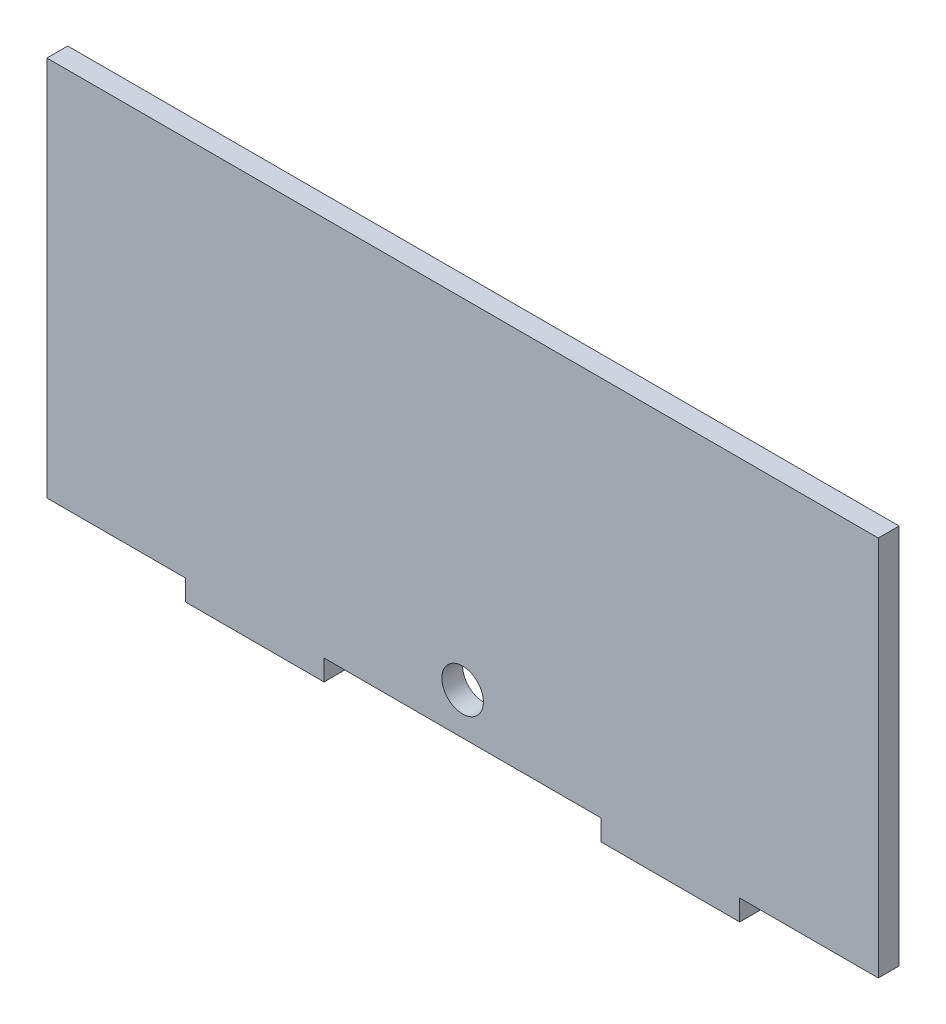
ISO-10303-21;
HEADER;
FILE_DESCRIPTION(('STEP AP214'),'2;1');
FILE_NAME('part.step','',(''),(''),'','','');
FILE_SCHEMA(('AUTOMOTIVE_DESIGN { 1 0 10303 214 1 1 1 1 }'));
ENDSEC;
DATA;
#1=APPLICATION_CONTEXT('core data for automotive mechanical design processes');
#2=APPLICATION_PROTOCOL_DEFINITION('international standard','automotive_design',2000,#1);
#3=PRODUCT_CONTEXT('',#1,'mechanical');
#4=PRODUCT('Part','Part','',(#3));
#5=PRODUCT_RELATED_PRODUCT_CATEGORY('part','',(#4));
#6=PRODUCT_DEFINITION_FORMATION('','',#4);
#7=PRODUCT_DEFINITION_CONTEXT('part definition',#1,'design');
#8=PRODUCT_DEFINITION('design','',#6,#7);
#9=PRODUCT_DEFINITION_SHAPE('','',#8);
#10=(LENGTH_UNIT() NAMED_UNIT(*) SI_UNIT(.MILLI.,.METRE.));
#11=(NAMED_UNIT(*) PLANE_ANGLE_UNIT() SI_UNIT($,.RADIAN.));
#12=(NAMED_UNIT(*) SI_UNIT($,.STERADIAN.) SOLID_ANGLE_UNIT());
#13=UNCERTAINTY_MEASURE_WITH_UNIT(LENGTH_MEASURE(1.E-05),#10,'distance_accuracy_value','');
#14=(GEOMETRIC_REPRESENTATION_CONTEXT(3) GLOBAL_UNCERTAINTY_ASSIGNED_CONTEXT((#13)) GLOBAL_UNIT_ASSIGNED_CONTEXT((#10,
#11,#12)) REPRESENTATION_CONTEXT('',''));
#15=CARTESIAN_POINT('',(0.,0.,0.));
#16=DIRECTION('',(0.,0.,1.));
#17=DIRECTION('',(1.,0.,0.));
#18=AXIS2_PLACEMENT_3D('',#15,#16,#17);
#19=CARTESIAN_POINT('',(0.,0.,-3.));
#20=DIRECTION('',(0.,-1.,0.));
#21=DIRECTION('',(0.,0.,-1.));
#22=AXIS2_PLACEMENT_3D('',#19,#20,#21);
#23=PLANE('',#22);
#24=DIRECTION('',(0.,0.,1.));
#25=VECTOR('',#24,1.);
#26=CARTESIAN_POINT('',(80.,0.,-3.));
#27=LINE('',#26,#25);
#28=CARTESIAN_POINT('',(80.,0.,-3.));
#29=VERTEX_POINT('',#28);
#30=CARTESIAN_POINT('',(80.,0.,0.));
#31=VERTEX_POINT('',#30);
#32=EDGE_CURVE('E147',#29,#31,#27,.T.);
#33=ORIENTED_EDGE('',*,*,#32,.T.);
#34=DIRECTION('',(1.,0.,0.));
#35=VECTOR('',#34,1.);
#36=CARTESIAN_POINT('',(0.,0.,0.));
#37=LINE('',#36,#35);
#38=CARTESIAN_POINT('',(40.,0.,0.));
#39=VERTEX_POINT('',#38);
#40=EDGE_CURVE('E211',#39,#31,#37,.T.);
#41=ORIENTED_EDGE('',*,*,#40,.F.);
#42=DIRECTION('',(0.,0.,1.));
#43=VECTOR('',#42,1.);
#44=CARTESIAN_POINT('',(40.,0.,-3.));
#45=LINE('',#44,#43);
#46=CARTESIAN_POINT('',(40.,0.,-3.));
#47=VERTEX_POINT('',#46);
#48=EDGE_CURVE('E178',#47,#39,#45,.T.);
#49=ORIENTED_EDGE('',*,*,#48,.F.);
#50=DIRECTION('',(1.,0.,0.));
#51=VECTOR('',#50,1.);
#52=CARTESIAN_POINT('',(0.,0.,-3.));
#53=LINE('',#52,#51);
#54=EDGE_CURVE('E198',#47,#29,#53,.T.);
#55=ORIENTED_EDGE('',*,*,#54,.T.);
#56=EDGE_LOOP('',(#33,#41,#49,#55));
#57=FACE_BOUND('',#56,.T.);
#58=ADVANCED_FACE('F33',(#57),#23,.T.);
#59=CARTESIAN_POINT('',(0.,0.,-3.));
#60=VERTEX_POINT('',#59);
#61=CARTESIAN_POINT('',(20.,0.,-3.));
#62=VERTEX_POINT('',#61);
#63=EDGE_CURVE('E194',#60,#62,#53,.T.);
#64=ORIENTED_EDGE('',*,*,#63,.T.);
#65=DIRECTION('',(0.,0.,1.));
#66=VECTOR('',#65,1.);
#67=CARTESIAN_POINT('',(20.,0.,-3.));
#68=LINE('',#67,#66);
#69=CARTESIAN_POINT('',(20.,0.,0.));
#70=VERTEX_POINT('',#69);
#71=EDGE_CURVE('E175',#62,#70,#68,.T.);
#72=ORIENTED_EDGE('',*,*,#71,.T.);
#73=CARTESIAN_POINT('',(0.,0.,0.));
#74=VERTEX_POINT('',#73);
#75=EDGE_CURVE('E207',#74,#70,#37,.T.);
#76=ORIENTED_EDGE('',*,*,#75,.F.);
#77=DIRECTION('',(0.,0.,1.));
#78=VECTOR('',#77,1.);
#79=CARTESIAN_POINT('',(0.,0.,-3.));
#80=LINE('',#79,#78);
#81=EDGE_CURVE('E37',#60,#74,#80,.T.);
#82=ORIENTED_EDGE('',*,*,#81,.F.);
#83=EDGE_LOOP('',(#64,#72,#76,#82));
#84=FACE_BOUND('',#83,.T.);
#85=ADVANCED_FACE('F227',(#84),#23,.T.);
#86=CARTESIAN_POINT('',(0.,0.,-3.));
#87=DIRECTION('',(-1.,0.,0.));
#88=DIRECTION('',(0.,0.,1.));
#89=AXIS2_PLACEMENT_3D('',#86,#87,#88);
#90=PLANE('',#89);
#91=DIRECTION('',(0.,-1.,0.));
#92=VECTOR('',#91,1.);
#93=CARTESIAN_POINT('',(0.,0.,0.));
#94=LINE('',#93,#92);
#95=CARTESIAN_POINT('',(0.,55.,0.));
#96=VERTEX_POINT('',#95);
#97=EDGE_CURVE('E186',#96,#74,#94,.T.);
#98=ORIENTED_EDGE('',*,*,#97,.F.);
#99=DIRECTION('',(0.,0.,1.));
#100=VECTOR('',#99,1.);
#101=CARTESIAN_POINT('',(0.,55.,-3.));
#102=LINE('',#101,#100);
#103=CARTESIAN_POINT('',(0.,55.,-3.));
#104=VERTEX_POINT('',#103);
#105=EDGE_CURVE('E11',#104,#96,#102,.T.);
#106=ORIENTED_EDGE('',*,*,#105,.F.);
#107=DIRECTION('',(0.,-1.,0.));
#108=VECTOR('',#107,1.);
#109=CARTESIAN_POINT('',(0.,0.,-3.));
#110=LINE('',#109,#108);
#111=EDGE_CURVE('E189',#104,#60,#110,.T.);
#112=ORIENTED_EDGE('',*,*,#111,.T.);
#113=ORIENTED_EDGE('',*,*,#81,.T.);
#114=EDGE_LOOP('',(#98,#106,#112,#113));
#115=FACE_BOUND('',#114,.T.);
#116=ADVANCED_FACE('F35',(#115),#90,.T.);
#117=CARTESIAN_POINT('',(0.,55.,-3.));
#118=DIRECTION('',(0.,1.,0.));
#119=DIRECTION('',(0.,0.,1.));
#120=AXIS2_PLACEMENT_3D('',#117,#118,#119);
#121=PLANE('',#120);
#122=DIRECTION('',(-1.,0.,0.));
#123=VECTOR('',#122,1.);
#124=CARTESIAN_POINT('',(0.,55.,0.));
#125=LINE('',#124,#123);
#126=CARTESIAN_POINT('',(120.,55.,0.));
#127=VERTEX_POINT('',#126);
#128=EDGE_CURVE('E193',#127,#96,#125,.T.);
#129=ORIENTED_EDGE('',*,*,#128,.F.);
#130=DIRECTION('',(0.,0.,1.));
#131=VECTOR('',#130,1.);
#132=CARTESIAN_POINT('',(120.,55.,-3.));
#133=LINE('',#132,#131);
#134=CARTESIAN_POINT('',(120.,55.,-3.));
#135=VERTEX_POINT('',#134);
#136=EDGE_CURVE('E42',#135,#127,#133,.T.);
#137=ORIENTED_EDGE('',*,*,#136,.F.);
#138=DIRECTION('',(-1.,0.,0.));
#139=VECTOR('',#138,1.);
#140=CARTESIAN_POINT('',(0.,55.,-3.));
#141=LINE('',#140,#139);
#142=EDGE_CURVE('E201',#135,#104,#141,.T.);
#143=ORIENTED_EDGE('',*,*,#142,.T.);
#144=ORIENTED_EDGE('',*,*,#105,.T.);
#145=EDGE_LOOP('',(#129,#137,#143,#144));
#146=FACE_BOUND('',#145,.T.);
#147=ADVANCED_FACE('F231',(#146),#121,.T.);
#148=CARTESIAN_POINT('',(120.,0.,-3.));
#149=DIRECTION('',(1.,0.,0.));
#150=DIRECTION('',(0.,0.,-1.));
#151=AXIS2_PLACEMENT_3D('',#148,#149,#150);
#152=PLANE('',#151);
#153=DIRECTION('',(0.,1.,0.));
#154=VECTOR('',#153,1.);
#155=CARTESIAN_POINT('',(120.,0.,0.));
#156=LINE('',#155,#154);
#157=CARTESIAN_POINT('',(120.,0.,0.));
#158=VERTEX_POINT('',#157);
#159=EDGE_CURVE('E210',#158,#127,#156,.T.);
#160=ORIENTED_EDGE('',*,*,#159,.F.);
#161=DIRECTION('',(0.,0.,1.));
#162=VECTOR('',#161,1.);
#163=CARTESIAN_POINT('',(120.,0.,-3.));
#164=LINE('',#163,#162);
#165=CARTESIAN_POINT('',(120.,0.,-3.));
#166=VERTEX_POINT('',#165);
#167=EDGE_CURVE('E216',#166,#158,#164,.T.);
#168=ORIENTED_EDGE('',*,*,#167,.F.);
#169=DIRECTION('',(0.,1.,0.));
#170=VECTOR('',#169,1.);
#171=CARTESIAN_POINT('',(120.,0.,-3.));
#172=LINE('',#171,#170);
#173=EDGE_CURVE('E197',#166,#135,#172,.T.);
#174=ORIENTED_EDGE('',*,*,#173,.T.);
#175=ORIENTED_EDGE('',*,*,#136,.T.);
#176=EDGE_LOOP('',(#160,#168,#174,#175));
#177=FACE_BOUND('',#176,.T.);
#178=ADVANCED_FACE('F267',(#177),#152,.T.);
#179=DIRECTION('',(0.,0.,1.));
#180=VECTOR('',#179,1.);
#181=CARTESIAN_POINT('',(100.,0.,-3.));
#182=LINE('',#181,#180);
#183=CARTESIAN_POINT('',(100.,0.,-3.));
#184=VERTEX_POINT('',#183);
#185=CARTESIAN_POINT('',(100.,0.,0.));
#186=VERTEX_POINT('',#185);
#187=EDGE_CURVE('E156',#184,#186,#182,.T.);
#188=ORIENTED_EDGE('',*,*,#187,.F.);
#189=EDGE_CURVE('E192',#184,#166,#53,.T.);
#190=ORIENTED_EDGE('',*,*,#189,.T.);
#191=ORIENTED_EDGE('',*,*,#167,.T.);
#192=EDGE_CURVE('E206',#186,#158,#37,.T.);
#193=ORIENTED_EDGE('',*,*,#192,.F.);
#194=EDGE_LOOP('',(#188,#190,#191,#193));
#195=FACE_BOUND('',#194,.T.);
#196=ADVANCED_FACE('F248',(#195),#23,.T.);
#197=CARTESIAN_POINT('',(0.,0.,-3.));
#198=DIRECTION('',(0.,0.,-1.));
#199=DIRECTION('',(-1.,0.,0.));
#200=AXIS2_PLACEMENT_3D('',#197,#198,#199);
#201=PLANE('',#200);
#202=CARTESIAN_POINT('',(60.,6.,-3.));
#203=DIRECTION('',(0.,0.,1.));
#204=DIRECTION('',(1.,0.,0.));
#205=AXIS2_PLACEMENT_3D('',#202,#203,#204);
#206=CIRCLE('',#205,3.00000000000001);
#207=CARTESIAN_POINT('',(63.,6.,-3.));
#208=VERTEX_POINT('',#207);
#209=EDGE_CURVE('E183',#208,#208,#206,.T.);
#210=ORIENTED_EDGE('',*,*,#209,.T.);
#211=EDGE_LOOP('',(#210));
#212=FACE_BOUND('',#211,.T.);
#213=ORIENTED_EDGE('',*,*,#111,.F.);
#214=ORIENTED_EDGE('',*,*,#142,.F.);
#215=ORIENTED_EDGE('',*,*,#173,.F.);
#216=ORIENTED_EDGE('',*,*,#189,.F.);
#217=DIRECTION('',(0.,1.,0.));
#218=VECTOR('',#217,1.);
#219=CARTESIAN_POINT('',(100.,0.,-3.));
#220=LINE('',#219,#218);
#221=CARTESIAN_POINT('',(100.,-3.,-3.));
#222=VERTEX_POINT('',#221);
#223=EDGE_CURVE('E133',#222,#184,#220,.T.);
#224=ORIENTED_EDGE('',*,*,#223,.F.);
#225=DIRECTION('',(1.,0.,0.));
#226=VECTOR('',#225,1.);
#227=CARTESIAN_POINT('',(80.,-3.,-3.));
#228=LINE('',#227,#226);
#229=CARTESIAN_POINT('',(80.,-3.,-3.));
#230=VERTEX_POINT('',#229);
#231=EDGE_CURVE('E127',#230,#222,#228,.T.);
#232=ORIENTED_EDGE('',*,*,#231,.F.);
#233=DIRECTION('',(0.,-1.,0.));
#234=VECTOR('',#233,1.);
#235=CARTESIAN_POINT('',(80.,0.,-3.));
#236=LINE('',#235,#234);
#237=EDGE_CURVE('E141',#29,#230,#236,.T.);
#238=ORIENTED_EDGE('',*,*,#237,.F.);
#239=ORIENTED_EDGE('',*,*,#54,.F.);
#240=DIRECTION('',(0.,1.,0.));
#241=VECTOR('',#240,1.);
#242=CARTESIAN_POINT('',(40.,0.,-3.));
#243=LINE('',#242,#241);
#244=CARTESIAN_POINT('',(40.,-3.,-3.));
#245=VERTEX_POINT('',#244);
#246=EDGE_CURVE('E166',#245,#47,#243,.T.);
#247=ORIENTED_EDGE('',*,*,#246,.F.);
#248=DIRECTION('',(1.,0.,0.));
#249=VECTOR('',#248,1.);
#250=CARTESIAN_POINT('',(20.,-3.,-3.));
#251=LINE('',#250,#249);
#252=CARTESIAN_POINT('',(20.,-3.,-3.));
#253=VERTEX_POINT('',#252);
#254=EDGE_CURVE('E162',#253,#245,#251,.T.);
#255=ORIENTED_EDGE('',*,*,#254,.F.);
#256=DIRECTION('',(0.,-1.,0.));
#257=VECTOR('',#256,1.);
#258=CARTESIAN_POINT('',(20.,0.,-3.));
#259=LINE('',#258,#257);
#260=EDGE_CURVE('E159',#62,#253,#259,.T.);
#261=ORIENTED_EDGE('',*,*,#260,.F.);
#262=ORIENTED_EDGE('',*,*,#63,.F.);
#263=EDGE_LOOP('',(#213,#214,#215,#216,#224,#232,#238,#239,#247,#255,#261,#262));
#264=FACE_BOUND('',#263,.T.);
#265=ADVANCED_FACE('F139',(#212,#264),#201,.T.);
#266=CARTESIAN_POINT('',(0.,0.,0.));
#267=DIRECTION('',(0.,0.,-1.));
#268=DIRECTION('',(-1.,0.,0.));
#269=AXIS2_PLACEMENT_3D('',#266,#267,#268);
#270=PLANE('',#269);
#271=CARTESIAN_POINT('',(60.,6.,0.));
#272=DIRECTION('',(0.,0.,1.));
#273=DIRECTION('',(1.,0.,0.));
#274=AXIS2_PLACEMENT_3D('',#271,#272,#273);
#275=CIRCLE('',#274,3.00000000000001);
#276=CARTESIAN_POINT('',(63.,6.,0.));
#277=VERTEX_POINT('',#276);
#278=EDGE_CURVE('E177',#277,#277,#275,.T.);
#279=ORIENTED_EDGE('',*,*,#278,.F.);
#280=EDGE_LOOP('',(#279));
#281=FACE_BOUND('',#280,.T.);
#282=ORIENTED_EDGE('',*,*,#97,.T.);
#283=ORIENTED_EDGE('',*,*,#75,.T.);
#284=DIRECTION('',(0.,-1.,0.));
#285=VECTOR('',#284,1.);
#286=CARTESIAN_POINT('',(20.,0.,0.));
#287=LINE('',#286,#285);
#288=CARTESIAN_POINT('',(20.,-3.,0.));
#289=VERTEX_POINT('',#288);
#290=EDGE_CURVE('E58',#70,#289,#287,.T.);
#291=ORIENTED_EDGE('',*,*,#290,.T.);
#292=DIRECTION('',(1.,0.,0.));
#293=VECTOR('',#292,1.);
#294=CARTESIAN_POINT('',(20.,-3.,0.));
#295=LINE('',#294,#293);
#296=CARTESIAN_POINT('',(40.,-3.,0.));
#297=VERTEX_POINT('',#296);
#298=EDGE_CURVE('E170',#289,#297,#295,.T.);
#299=ORIENTED_EDGE('',*,*,#298,.T.);
#300=DIRECTION('',(0.,1.,0.));
#301=VECTOR('',#300,1.);
#302=CARTESIAN_POINT('',(40.,0.,0.));
#303=LINE('',#302,#301);
#304=EDGE_CURVE('E163',#297,#39,#303,.T.);
#305=ORIENTED_EDGE('',*,*,#304,.T.);
#306=ORIENTED_EDGE('',*,*,#40,.T.);
#307=DIRECTION('',(0.,-1.,0.));
#308=VECTOR('',#307,1.);
#309=CARTESIAN_POINT('',(80.,0.,0.));
#310=LINE('',#309,#308);
#311=CARTESIAN_POINT('',(80.,-3.,0.));
#312=VERTEX_POINT('',#311);
#313=EDGE_CURVE('E152',#31,#312,#310,.T.);
#314=ORIENTED_EDGE('',*,*,#313,.T.);
#315=DIRECTION('',(1.,0.,0.));
#316=VECTOR('',#315,1.);
#317=CARTESIAN_POINT('',(80.,-3.,0.));
#318=LINE('',#317,#316);
#319=CARTESIAN_POINT('',(100.,-3.,0.));
#320=VERTEX_POINT('',#319);
#321=EDGE_CURVE('E128',#312,#320,#318,.T.);
#322=ORIENTED_EDGE('',*,*,#321,.T.);
#323=DIRECTION('',(0.,1.,0.));
#324=VECTOR('',#323,1.);
#325=CARTESIAN_POINT('',(100.,0.,0.));
#326=LINE('',#325,#324);
#327=EDGE_CURVE('E50',#320,#186,#326,.T.);
#328=ORIENTED_EDGE('',*,*,#327,.T.);
#329=ORIENTED_EDGE('',*,*,#192,.T.);
#330=ORIENTED_EDGE('',*,*,#159,.T.);
#331=ORIENTED_EDGE('',*,*,#128,.T.);
#332=EDGE_LOOP('',(#282,#283,#291,#299,#305,#306,#314,#322,#328,#329,#330,#331));
#333=FACE_BOUND('',#332,.T.);
#334=ADVANCED_FACE('F228',(#281,#333),#270,.F.);
#335=CARTESIAN_POINT('',(60.,6.,-3.));
#336=DIRECTION('',(0.,0.,1.));
#337=DIRECTION('',(1.,0.,0.));
#338=AXIS2_PLACEMENT_3D('',#335,#336,#337);
#339=CYLINDRICAL_SURFACE('',#338,3.00000000000001);
#340=ORIENTED_EDGE('',*,*,#209,.F.);
#341=EDGE_LOOP('',(#340));
#342=FACE_BOUND('',#341,.T.);
#343=ORIENTED_EDGE('',*,*,#278,.T.);
#344=EDGE_LOOP('',(#343));
#345=FACE_BOUND('',#344,.T.);
#346=ADVANCED_FACE('F258',(#342,#345),#339,.F.);
#347=CARTESIAN_POINT('',(20.,0.,-3.));
#348=DIRECTION('',(-1.,0.,0.));
#349=DIRECTION('',(0.,0.,1.));
#350=AXIS2_PLACEMENT_3D('',#347,#348,#349);
#351=PLANE('',#350);
#352=ORIENTED_EDGE('',*,*,#290,.F.);
#353=ORIENTED_EDGE('',*,*,#71,.F.);
#354=ORIENTED_EDGE('',*,*,#260,.T.);
#355=DIRECTION('',(0.,0.,1.));
#356=VECTOR('',#355,1.);
#357=CARTESIAN_POINT('',(20.,-3.,-3.));
#358=LINE('',#357,#356);
#359=EDGE_CURVE('E168',#253,#289,#358,.T.);
#360=ORIENTED_EDGE('',*,*,#359,.T.);
#361=EDGE_LOOP('',(#352,#353,#354,#360));
#362=FACE_BOUND('',#361,.T.);
#363=ADVANCED_FACE('F237',(#362),#351,.T.);
#364=CARTESIAN_POINT('',(40.,0.,-3.));
#365=DIRECTION('',(1.,0.,0.));
#366=DIRECTION('',(0.,1.,0.));
#367=AXIS2_PLACEMENT_3D('',#364,#365,#366);
#368=PLANE('',#367);
#369=ORIENTED_EDGE('',*,*,#304,.F.);
#370=DIRECTION('',(0.,0.,1.));
#371=VECTOR('',#370,1.);
#372=CARTESIAN_POINT('',(40.,-3.,-3.));
#373=LINE('',#372,#371);
#374=EDGE_CURVE('E180',#245,#297,#373,.T.);
#375=ORIENTED_EDGE('',*,*,#374,.F.);
#376=ORIENTED_EDGE('',*,*,#246,.T.);
#377=ORIENTED_EDGE('',*,*,#48,.T.);
#378=EDGE_LOOP('',(#369,#375,#376,#377));
#379=FACE_BOUND('',#378,.T.);
#380=ADVANCED_FACE('F250',(#379),#368,.T.);
#381=CARTESIAN_POINT('',(20.,-3.,-3.));
#382=DIRECTION('',(0.,-1.,0.));
#383=DIRECTION('',(1.,0.,0.));
#384=AXIS2_PLACEMENT_3D('',#381,#382,#383);
#385=PLANE('',#384);
#386=ORIENTED_EDGE('',*,*,#298,.F.);
#387=ORIENTED_EDGE('',*,*,#359,.F.);
#388=ORIENTED_EDGE('',*,*,#254,.T.);
#389=ORIENTED_EDGE('',*,*,#374,.T.);
#390=EDGE_LOOP('',(#386,#387,#388,#389));
#391=FACE_BOUND('',#390,.T.);
#392=ADVANCED_FACE('F240',(#391),#385,.T.);
#393=CARTESIAN_POINT('',(80.,0.,-3.));
#394=DIRECTION('',(-1.,0.,0.));
#395=DIRECTION('',(0.,0.,1.));
#396=AXIS2_PLACEMENT_3D('',#393,#394,#395);
#397=PLANE('',#396);
#398=ORIENTED_EDGE('',*,*,#313,.F.);
#399=ORIENTED_EDGE('',*,*,#32,.F.);
#400=ORIENTED_EDGE('',*,*,#237,.T.);
#401=DIRECTION('',(0.,0.,1.));
#402=VECTOR('',#401,1.);
#403=CARTESIAN_POINT('',(80.,-3.,-3.));
#404=LINE('',#403,#402);
#405=EDGE_CURVE('E124',#230,#312,#404,.T.);
#406=ORIENTED_EDGE('',*,*,#405,.T.);
#407=EDGE_LOOP('',(#398,#399,#400,#406));
#408=FACE_BOUND('',#407,.T.);
#409=ADVANCED_FACE('F145',(#408),#397,.T.);
#410=CARTESIAN_POINT('',(100.,0.,-3.));
#411=DIRECTION('',(1.,0.,0.));
#412=DIRECTION('',(0.,0.,-1.));
#413=AXIS2_PLACEMENT_3D('',#410,#411,#412);
#414=PLANE('',#413);
#415=ORIENTED_EDGE('',*,*,#327,.F.);
#416=DIRECTION('',(0.,0.,1.));
#417=VECTOR('',#416,1.);
#418=CARTESIAN_POINT('',(100.,-3.,-3.));
#419=LINE('',#418,#417);
#420=EDGE_CURVE('E132',#222,#320,#419,.T.);
#421=ORIENTED_EDGE('',*,*,#420,.F.);
#422=ORIENTED_EDGE('',*,*,#223,.T.);
#423=ORIENTED_EDGE('',*,*,#187,.T.);
#424=EDGE_LOOP('',(#415,#421,#422,#423));
#425=FACE_BOUND('',#424,.T.);
#426=ADVANCED_FACE('F318',(#425),#414,.T.);
#427=CARTESIAN_POINT('',(80.,-3.,-3.));
#428=DIRECTION('',(0.,-1.,0.));
#429=DIRECTION('',(0.,0.,-1.));
#430=AXIS2_PLACEMENT_3D('',#427,#428,#429);
#431=PLANE('',#430);
#432=ORIENTED_EDGE('',*,*,#321,.F.);
#433=ORIENTED_EDGE('',*,*,#405,.F.);
#434=ORIENTED_EDGE('',*,*,#231,.T.);
#435=ORIENTED_EDGE('',*,*,#420,.T.);
#436=EDGE_LOOP('',(#432,#433,#434,#435));
#437=FACE_BOUND('',#436,.T.);
#438=ADVANCED_FACE('F126',(#437),#431,.T.);
#439=CLOSED_SHELL('',(#58,#85,#116,#147,#178,#196,#265,#334,#346,#363,#380,#392,#409,#426,#438));
#440=MANIFOLD_SOLID_BREP('B2',#439);
#441=ADVANCED_BREP_SHAPE_REPRESENTATION('',(#18,#440),#14);
#442=SHAPE_DEFINITION_REPRESENTATION(#9,#441);
ENDSEC;
END-ISO-10303-21;
